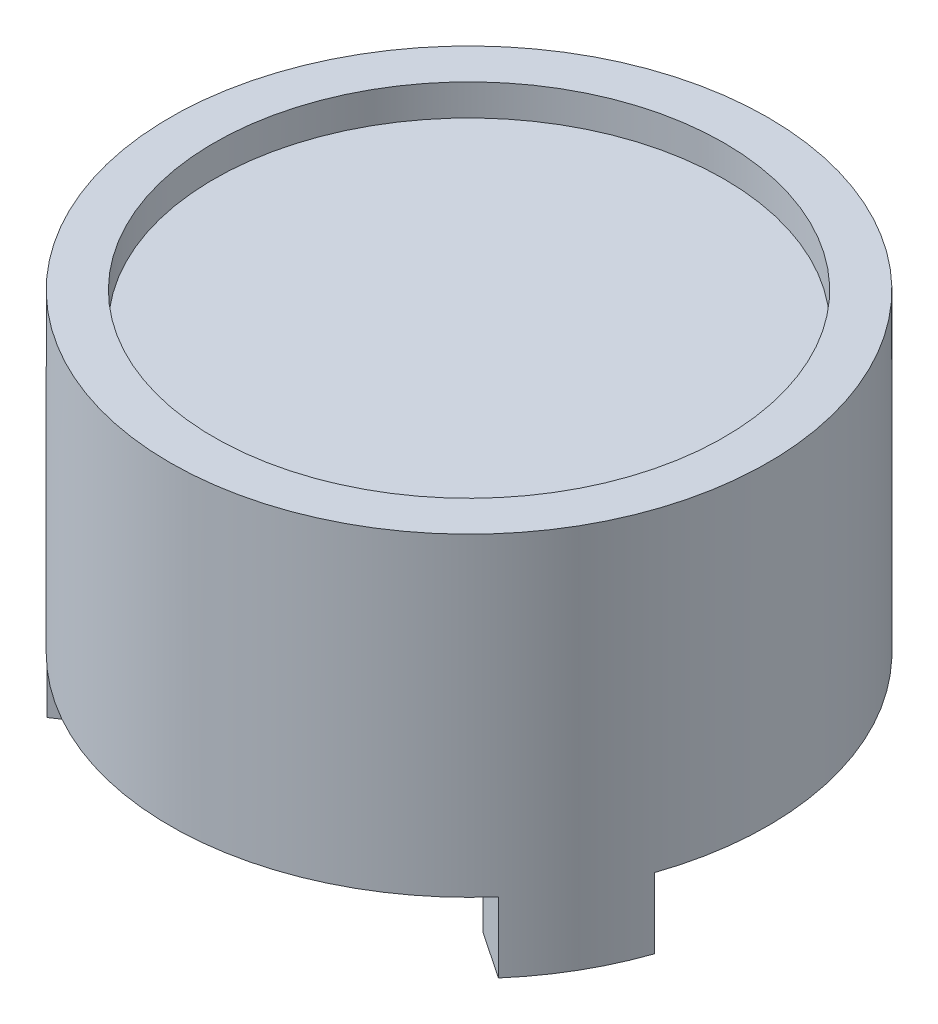
ISO-10303-21;
HEADER;
FILE_DESCRIPTION(('STEP AP214'),'2;1');
FILE_NAME('part.step','',(''),(''),'','','');
FILE_SCHEMA(('AUTOMOTIVE_DESIGN { 1 0 10303 214 1 1 1 1 }'));
ENDSEC;
DATA;
#1=APPLICATION_CONTEXT('core data for automotive mechanical design processes');
#2=APPLICATION_PROTOCOL_DEFINITION('international standard','automotive_design',2000,#1);
#3=PRODUCT_CONTEXT('',#1,'mechanical');
#4=PRODUCT('Part','Part','',(#3));
#5=PRODUCT_RELATED_PRODUCT_CATEGORY('part','',(#4));
#6=PRODUCT_DEFINITION_FORMATION('','',#4);
#7=PRODUCT_DEFINITION_CONTEXT('part definition',#1,'design');
#8=PRODUCT_DEFINITION('design','',#6,#7);
#9=PRODUCT_DEFINITION_SHAPE('','',#8);
#10=(LENGTH_UNIT() NAMED_UNIT(*) SI_UNIT(.MILLI.,.METRE.));
#11=(NAMED_UNIT(*) PLANE_ANGLE_UNIT() SI_UNIT($,.RADIAN.));
#12=(NAMED_UNIT(*) SI_UNIT($,.STERADIAN.) SOLID_ANGLE_UNIT());
#13=UNCERTAINTY_MEASURE_WITH_UNIT(LENGTH_MEASURE(1.E-05),#10,'distance_accuracy_value','');
#14=(GEOMETRIC_REPRESENTATION_CONTEXT(3) GLOBAL_UNCERTAINTY_ASSIGNED_CONTEXT((#13)) GLOBAL_UNIT_ASSIGNED_CONTEXT((#10,
#11,#12)) REPRESENTATION_CONTEXT('',''));
#15=CARTESIAN_POINT('',(0.,0.,0.));
#16=DIRECTION('',(0.,0.,1.));
#17=DIRECTION('',(1.,0.,0.));
#18=AXIS2_PLACEMENT_3D('',#15,#16,#17);
#19=CARTESIAN_POINT('',(13.5,0.,0.));
#20=DIRECTION('',(0.,-1.,0.));
#21=DIRECTION('',(0.,0.,-1.));
#22=AXIS2_PLACEMENT_3D('',#19,#20,#21);
#23=PLANE('',#22);
#24=CARTESIAN_POINT('',(0.,0.,0.));
#25=DIRECTION('',(0.,-1.,0.));
#26=DIRECTION('',(0.,0.,-1.));
#27=AXIS2_PLACEMENT_3D('',#24,#25,#26);
#28=CIRCLE('',#27,17.);
#29=CARTESIAN_POINT('',(-16.0758866509983,0.,5.52864073568305));
#30=VERTEX_POINT('',#29);
#31=CARTESIAN_POINT('',(-3.25,0.,-16.6864465959652));
#32=VERTEX_POINT('',#31);
#33=EDGE_CURVE('E307',#30,#32,#28,.T.);
#34=ORIENTED_EDGE('',*,*,#33,.T.);
#35=DIRECTION('',(0.0707642638276949,0.,0.997493067126245));
#36=VECTOR('',#35,1.);
#37=CARTESIAN_POINT('',(-3.25,0.,-16.6864465959652));
#38=LINE('',#37,#36);
#39=CARTESIAN_POINT('',(-3.02073627194071,0.,-13.4547450715984));
#40=VERTEX_POINT('',#39);
#41=EDGE_CURVE('E179',#32,#40,#38,.T.);
#42=ORIENTED_EDGE('',*,*,#41,.T.);
#43=CARTESIAN_POINT('',(-2.76737303289064,0.,-13.4727191946106));
#44=DIRECTION('',(0.,-1.,0.));
#45=DIRECTION('',(0.,0.,-1.));
#46=AXIS2_PLACEMENT_3D('',#43,#44,#45);
#47=CIRCLE('',#46,0.254);
#48=CARTESIAN_POINT('',(-2.71626697280963,0.,-13.2239137070847));
#49=VERTEX_POINT('',#48);
#50=EDGE_CURVE('E256',#40,#49,#47,.F.);
#51=ORIENTED_EDGE('',*,*,#50,.T.);
#52=CARTESIAN_POINT('',(0.,0.,0.));
#53=DIRECTION('',(0.,-1.,0.));
#54=DIRECTION('',(0.,0.,-1.));
#55=AXIS2_PLACEMENT_3D('',#52,#53,#54);
#56=CIRCLE('',#55,13.5);
#57=CARTESIAN_POINT('',(-12.8103786941935,0.,4.25960065162845));
#58=VERTEX_POINT('',#57);
#59=EDGE_CURVE('E309',#58,#49,#56,.T.);
#60=ORIENTED_EDGE('',*,*,#59,.F.);
#61=CARTESIAN_POINT('',(-13.0514035970324,0.,4.33974424907391));
#62=DIRECTION('',(0.,-1.,0.));
#63=DIRECTION('',(0.,0.,-1.));
#64=AXIS2_PLACEMENT_3D('',#61,#62,#63);
#65=CIRCLE('',#64,0.254);
#66=CARTESIAN_POINT('',(-13.1625191694181,0.,4.11133818616532));
#67=VERTEX_POINT('',#66);
#68=EDGE_CURVE('E251',#58,#67,#65,.F.);
#69=ORIENTED_EDGE('',*,*,#68,.T.);
#70=DIRECTION('',(-0.899236468144036,0.,0.437462883408226));
#71=VECTOR('',#70,1.);
#72=CARTESIAN_POINT('',(-16.0758866509983,0.,5.52864073568305));
#73=LINE('',#72,#71);
#74=EDGE_CURVE('E293',#67,#30,#73,.T.);
#75=ORIENTED_EDGE('',*,*,#74,.T.);
#76=EDGE_LOOP('',(#34,#42,#51,#60,#69,#75));
#77=FACE_BOUND('',#76,.T.);
#78=ADVANCED_FACE('F48',(#77),#23,.T.);
#79=CARTESIAN_POINT('',(-16.0758866509983,-4.,5.52864073568305));
#80=DIRECTION('',(-0.437462883408226,0.,-0.899236468144036));
#81=DIRECTION('',(-0.899236468144036,0.,0.437462883408226));
#82=AXIS2_PLACEMENT_3D('',#79,#80,#81);
#83=PLANE('',#82);
#84=ORIENTED_EDGE('',*,*,#74,.F.);
#85=DIRECTION('',(0.,-1.,0.));
#86=VECTOR('',#85,1.);
#87=CARTESIAN_POINT('',(-13.1625191694181,-4.,4.11133818616532));
#88=LINE('',#87,#86);
#89=CARTESIAN_POINT('',(-13.1625191694181,-4.,4.11133818616532));
#90=VERTEX_POINT('',#89);
#91=EDGE_CURVE('E292',#67,#90,#88,.T.);
#92=ORIENTED_EDGE('',*,*,#91,.T.);
#93=DIRECTION('',(-0.899236468144036,0.,0.437462883408226));
#94=VECTOR('',#93,1.);
#95=CARTESIAN_POINT('',(-16.0758866509983,-4.,5.52864073568305));
#96=LINE('',#95,#94);
#97=CARTESIAN_POINT('',(-16.0758866509983,-4.,5.52864073568305));
#98=VERTEX_POINT('',#97);
#99=EDGE_CURVE('E411',#90,#98,#96,.T.);
#100=ORIENTED_EDGE('',*,*,#99,.T.);
#101=DIRECTION('',(0.,1.,0.));
#102=VECTOR('',#101,1.);
#103=CARTESIAN_POINT('',(-16.0758866509983,-4.,5.52864073568305));
#104=LINE('',#103,#102);
#105=EDGE_CURVE('E282',#98,#30,#104,.T.);
#106=ORIENTED_EDGE('',*,*,#105,.T.);
#107=EDGE_LOOP('',(#84,#92,#100,#106));
#108=FACE_BOUND('',#107,.T.);
#109=ADVANCED_FACE('F367',(#108),#83,.T.);
#110=CARTESIAN_POINT('',(-12.8258866509984,-4.,11.1578058602819));
#111=DIRECTION('',(0.560030183718003,0.,0.828472204316343));
#112=DIRECTION('',(0.828472204316343,0.,-0.560030183718003));
#113=AXIS2_PLACEMENT_3D('',#110,#111,#112);
#114=PLANE('',#113);
#115=DIRECTION('',(0.828472204316343,0.,-0.560030183718003));
#116=VECTOR('',#115,1.);
#117=CARTESIAN_POINT('',(-12.8258866509984,-4.,11.1578058602819));
#118=LINE('',#117,#116);
#119=CARTESIAN_POINT('',(-12.8258866509984,-4.,11.1578058602819));
#120=VERTEX_POINT('',#119);
#121=CARTESIAN_POINT('',(-10.1417828974774,-4.,9.34340688543286));
#122=VERTEX_POINT('',#121);
#123=EDGE_CURVE('E400',#120,#122,#118,.T.);
#124=ORIENTED_EDGE('',*,*,#123,.T.);
#125=DIRECTION('',(0.,-1.,0.));
#126=VECTOR('',#125,1.);
#127=CARTESIAN_POINT('',(-10.1417828974774,-4.,9.34340688543286));
#128=LINE('',#127,#126);
#129=CARTESIAN_POINT('',(-10.1417828974774,0.,9.34340688543286));
#130=VERTEX_POINT('',#129);
#131=EDGE_CURVE('E399',#122,#130,#128,.F.);
#132=ORIENTED_EDGE('',*,*,#131,.T.);
#133=DIRECTION('',(0.828472204316343,0.,-0.560030183718003));
#134=VECTOR('',#133,1.);
#135=CARTESIAN_POINT('',(-12.8258866509984,0.,11.1578058602819));
#136=LINE('',#135,#134);
#137=CARTESIAN_POINT('',(-12.8258866509984,0.,11.1578058602819));
#138=VERTEX_POINT('',#137);
#139=EDGE_CURVE('E390',#138,#130,#136,.T.);
#140=ORIENTED_EDGE('',*,*,#139,.F.);
#141=DIRECTION('',(0.,1.,0.));
#142=VECTOR('',#141,1.);
#143=CARTESIAN_POINT('',(-12.8258866509984,-4.,11.1578058602819));
#144=LINE('',#143,#142);
#145=EDGE_CURVE('E296',#120,#138,#144,.T.);
#146=ORIENTED_EDGE('',*,*,#145,.F.);
#147=EDGE_LOOP('',(#124,#132,#140,#146));
#148=FACE_BOUND('',#147,.T.);
#149=ADVANCED_FACE('F372',(#148),#114,.T.);
#150=CARTESIAN_POINT('',(0.,-4.,0.));
#151=DIRECTION('',(0.,-1.,0.));
#152=DIRECTION('',(-0.866025403784443,0.,0.499999999999992));
#153=AXIS2_PLACEMENT_3D('',#150,#151,#152);
#154=PLANE('',#153);
#155=ORIENTED_EDGE('',*,*,#99,.F.);
#156=CARTESIAN_POINT('',(-13.0514035970324,-4.,4.33974424907391));
#157=DIRECTION('',(0.,-1.,0.));
#158=DIRECTION('',(0.,0.,-1.));
#159=AXIS2_PLACEMENT_3D('',#156,#157,#158);
#160=CIRCLE('',#159,0.254);
#161=CARTESIAN_POINT('',(-12.8103786941935,-4.,4.25960065162845));
#162=VERTEX_POINT('',#161);
#163=EDGE_CURVE('E444',#90,#162,#160,.T.);
#164=ORIENTED_EDGE('',*,*,#163,.T.);
#165=CARTESIAN_POINT('',(0.,-4.,0.));
#166=DIRECTION('',(0.,-1.,0.));
#167=DIRECTION('',(0.866025403784443,0.,-0.499999999999992));
#168=AXIS2_PLACEMENT_3D('',#165,#166,#167);
#169=CIRCLE('',#168,13.5);
#170=CARTESIAN_POINT('',(-10.0941117213839,-4.,8.96431305545607));
#171=VERTEX_POINT('',#170);
#172=EDGE_CURVE('E409',#171,#162,#169,.T.);
#173=ORIENTED_EDGE('',*,*,#172,.F.);
#174=CARTESIAN_POINT('',(-10.2840305641418,-4.,9.13297494553651));
#175=DIRECTION('',(0.,-1.,0.));
#176=DIRECTION('',(0.,0.,-1.));
#177=AXIS2_PLACEMENT_3D('',#174,#175,#176);
#178=CIRCLE('',#177,0.254);
#179=EDGE_CURVE('E443',#171,#122,#178,.T.);
#180=ORIENTED_EDGE('',*,*,#179,.T.);
#181=ORIENTED_EDGE('',*,*,#123,.F.);
#182=CARTESIAN_POINT('',(0.,-4.,0.));
#183=DIRECTION('',(0.,1.,0.));
#184=DIRECTION('',(-0.866025403784443,0.,0.499999999999992));
#185=AXIS2_PLACEMENT_3D('',#182,#183,#184);
#186=CIRCLE('',#185,17.);
#187=EDGE_CURVE('E324',#98,#120,#186,.T.);
#188=ORIENTED_EDGE('',*,*,#187,.F.);
#189=EDGE_LOOP('',(#155,#164,#173,#180,#181,#188));
#190=FACE_BOUND('',#189,.T.);
#191=ADVANCED_FACE('F379',(#190),#154,.T.);
#192=CARTESIAN_POINT('',(12.8258866509982,0.,11.1578058602821));
#193=VERTEX_POINT('',#192);
#194=EDGE_CURVE('E319',#193,#138,#28,.T.);
#195=ORIENTED_EDGE('',*,*,#194,.T.);
#196=ORIENTED_EDGE('',*,*,#139,.T.);
#197=CARTESIAN_POINT('',(-10.2840305641418,0.,9.13297494553651));
#198=DIRECTION('',(0.,-1.,0.));
#199=DIRECTION('',(0.,0.,-1.));
#200=AXIS2_PLACEMENT_3D('',#197,#198,#199);
#201=CIRCLE('',#200,0.254);
#202=CARTESIAN_POINT('',(-10.0941117213839,0.,8.96431305545607));
#203=VERTEX_POINT('',#202);
#204=EDGE_CURVE('E253',#130,#203,#201,.F.);
#205=ORIENTED_EDGE('',*,*,#204,.T.);
#206=CARTESIAN_POINT('',(10.0941117213838,0.,8.96431305545621));
#207=VERTEX_POINT('',#206);
#208=EDGE_CURVE('E222',#207,#203,#56,.T.);
#209=ORIENTED_EDGE('',*,*,#208,.F.);
#210=CARTESIAN_POINT('',(10.2840305641417,0.,9.13297494553665));
#211=DIRECTION('',(0.,-1.,0.));
#212=DIRECTION('',(0.,0.,-1.));
#213=AXIS2_PLACEMENT_3D('',#210,#211,#212);
#214=CIRCLE('',#213,0.254);
#215=CARTESIAN_POINT('',(10.1417828974773,0.,9.343406885433));
#216=VERTEX_POINT('',#215);
#217=EDGE_CURVE('E13',#207,#216,#214,.F.);
#218=ORIENTED_EDGE('',*,*,#217,.T.);
#219=DIRECTION('',(0.828472204316335,0.,0.560030183718015));
#220=VECTOR('',#219,1.);
#221=CARTESIAN_POINT('',(12.8258866509982,0.,11.1578058602821));
#222=LINE('',#221,#220);
#223=EDGE_CURVE('E238',#216,#193,#222,.T.);
#224=ORIENTED_EDGE('',*,*,#223,.T.);
#225=EDGE_LOOP('',(#195,#196,#205,#209,#218,#224));
#226=FACE_BOUND('',#225,.T.);
#227=ADVANCED_FACE('F364',(#226),#23,.T.);
#228=CARTESIAN_POINT('',(12.8258866509982,-4.,11.1578058602821));
#229=DIRECTION('',(-0.560030183718015,0.,0.828472204316335));
#230=DIRECTION('',(0.828472204316335,0.,0.560030183718015));
#231=AXIS2_PLACEMENT_3D('',#228,#229,#230);
#232=PLANE('',#231);
#233=ORIENTED_EDGE('',*,*,#223,.F.);
#234=DIRECTION('',(0.,-1.,0.));
#235=VECTOR('',#234,1.);
#236=CARTESIAN_POINT('',(10.1417828974773,-4.,9.343406885433));
#237=LINE('',#236,#235);
#238=CARTESIAN_POINT('',(10.1417828974773,-4.,9.343406885433));
#239=VERTEX_POINT('',#238);
#240=EDGE_CURVE('E68',#216,#239,#237,.T.);
#241=ORIENTED_EDGE('',*,*,#240,.T.);
#242=DIRECTION('',(0.828472204316335,0.,0.560030183718015));
#243=VECTOR('',#242,1.);
#244=CARTESIAN_POINT('',(12.8258866509982,-4.,11.1578058602821));
#245=LINE('',#244,#243);
#246=CARTESIAN_POINT('',(12.8258866509982,-4.,11.1578058602821));
#247=VERTEX_POINT('',#246);
#248=EDGE_CURVE('E221',#239,#247,#245,.T.);
#249=ORIENTED_EDGE('',*,*,#248,.T.);
#250=DIRECTION('',(0.,1.,0.));
#251=VECTOR('',#250,1.);
#252=CARTESIAN_POINT('',(12.8258866509982,-4.,11.1578058602821));
#253=LINE('',#252,#251);
#254=EDGE_CURVE('E243',#247,#193,#253,.T.);
#255=ORIENTED_EDGE('',*,*,#254,.T.);
#256=EDGE_LOOP('',(#233,#241,#249,#255));
#257=FACE_BOUND('',#256,.T.);
#258=ADVANCED_FACE('F378',(#257),#232,.T.);
#259=CARTESIAN_POINT('',(16.0758866509982,-4.,5.52864073568327));
#260=DIRECTION('',(0.437462883408239,0.,-0.89923646814403));
#261=DIRECTION('',(-0.899236468144031,0.,-0.437462883408239));
#262=AXIS2_PLACEMENT_3D('',#259,#260,#261);
#263=PLANE('',#262);
#264=DIRECTION('',(-0.89923646814403,0.,-0.437462883408239));
#265=VECTOR('',#264,1.);
#266=CARTESIAN_POINT('',(16.0758866509982,-4.,5.52864073568327));
#267=LINE('',#266,#265);
#268=CARTESIAN_POINT('',(16.0758866509982,-4.,5.52864073568327));
#269=VERTEX_POINT('',#268);
#270=CARTESIAN_POINT('',(13.162519169418,-4.,4.11133818616551));
#271=VERTEX_POINT('',#270);
#272=EDGE_CURVE('E227',#269,#271,#267,.T.);
#273=ORIENTED_EDGE('',*,*,#272,.T.);
#274=DIRECTION('',(0.,-1.,0.));
#275=VECTOR('',#274,1.);
#276=CARTESIAN_POINT('',(13.162519169418,-4.,4.11133818616551));
#277=LINE('',#276,#275);
#278=CARTESIAN_POINT('',(13.162519169418,0.,4.11133818616551));
#279=VERTEX_POINT('',#278);
#280=EDGE_CURVE('E424',#271,#279,#277,.F.);
#281=ORIENTED_EDGE('',*,*,#280,.T.);
#282=DIRECTION('',(-0.89923646814403,0.,-0.437462883408239));
#283=VECTOR('',#282,1.);
#284=CARTESIAN_POINT('',(16.0758866509982,0.,5.52864073568327));
#285=LINE('',#284,#283);
#286=CARTESIAN_POINT('',(16.0758866509982,0.,5.52864073568327));
#287=VERTEX_POINT('',#286);
#288=EDGE_CURVE('E230',#287,#279,#285,.T.);
#289=ORIENTED_EDGE('',*,*,#288,.F.);
#290=DIRECTION('',(0.,1.,0.));
#291=VECTOR('',#290,1.);
#292=CARTESIAN_POINT('',(16.0758866509982,-4.,5.52864073568327));
#293=LINE('',#292,#291);
#294=EDGE_CURVE('E233',#269,#287,#293,.T.);
#295=ORIENTED_EDGE('',*,*,#294,.F.);
#296=EDGE_LOOP('',(#273,#281,#289,#295));
#297=FACE_BOUND('',#296,.T.);
#298=ADVANCED_FACE('F384',(#297),#263,.T.);
#299=CARTESIAN_POINT('',(0.,-4.,0.));
#300=DIRECTION('',(0.,-1.,0.));
#301=DIRECTION('',(0.866025403784436,0.,0.500000000000004));
#302=AXIS2_PLACEMENT_3D('',#299,#300,#301);
#303=PLANE('',#302);
#304=CARTESIAN_POINT('',(0.,-4.,0.));
#305=DIRECTION('',(0.,-1.,0.));
#306=DIRECTION('',(-0.866025403784436,0.,-0.500000000000004));
#307=AXIS2_PLACEMENT_3D('',#304,#305,#306);
#308=CIRCLE('',#307,13.5);
#309=CARTESIAN_POINT('',(12.8103786941934,-4.,4.25960065162863));
#310=VERTEX_POINT('',#309);
#311=CARTESIAN_POINT('',(10.0941117213838,-4.,8.96431305545621));
#312=VERTEX_POINT('',#311);
#313=EDGE_CURVE('E224',#310,#312,#308,.T.);
#314=ORIENTED_EDGE('',*,*,#313,.F.);
#315=CARTESIAN_POINT('',(13.0514035970323,-4.,4.33974424907409));
#316=DIRECTION('',(0.,-1.,0.));
#317=DIRECTION('',(0.,0.,-1.));
#318=AXIS2_PLACEMENT_3D('',#315,#316,#317);
#319=CIRCLE('',#318,0.254);
#320=EDGE_CURVE('E248',#310,#271,#319,.T.);
#321=ORIENTED_EDGE('',*,*,#320,.T.);
#322=ORIENTED_EDGE('',*,*,#272,.F.);
#323=CARTESIAN_POINT('',(0.,-4.,0.));
#324=DIRECTION('',(0.,1.,0.));
#325=DIRECTION('',(0.866025403784436,0.,0.500000000000004));
#326=AXIS2_PLACEMENT_3D('',#323,#324,#325);
#327=CIRCLE('',#326,17.);
#328=EDGE_CURVE('E219',#247,#269,#327,.T.);
#329=ORIENTED_EDGE('',*,*,#328,.F.);
#330=ORIENTED_EDGE('',*,*,#248,.F.);
#331=CARTESIAN_POINT('',(10.2840305641417,-4.,9.13297494553665));
#332=DIRECTION('',(0.,-1.,0.));
#333=DIRECTION('',(0.,0.,-1.));
#334=AXIS2_PLACEMENT_3D('',#331,#332,#333);
#335=CIRCLE('',#334,0.254);
#336=EDGE_CURVE('E429',#239,#312,#335,.T.);
#337=ORIENTED_EDGE('',*,*,#336,.T.);
#338=EDGE_LOOP('',(#314,#321,#322,#329,#330,#337));
#339=FACE_BOUND('',#338,.T.);
#340=ADVANCED_FACE('F362',(#339),#303,.T.);
#341=CARTESIAN_POINT('',(3.25,0.,-16.6864465959652));
#342=VERTEX_POINT('',#341);
#343=EDGE_CURVE('E314',#342,#287,#28,.T.);
#344=ORIENTED_EDGE('',*,*,#343,.T.);
#345=ORIENTED_EDGE('',*,*,#288,.T.);
#346=CARTESIAN_POINT('',(13.0514035970323,0.,4.33974424907409));
#347=DIRECTION('',(0.,-1.,0.));
#348=DIRECTION('',(0.,0.,-1.));
#349=AXIS2_PLACEMENT_3D('',#346,#347,#348);
#350=CIRCLE('',#349,0.254);
#351=CARTESIAN_POINT('',(12.8103786941934,0.,4.25960065162863));
#352=VERTEX_POINT('',#351);
#353=EDGE_CURVE('E56',#279,#352,#350,.F.);
#354=ORIENTED_EDGE('',*,*,#353,.T.);
#355=CARTESIAN_POINT('',(2.71626697280963,0.,-13.2239137070847));
#356=VERTEX_POINT('',#355);
#357=EDGE_CURVE('E264',#356,#352,#56,.T.);
#358=ORIENTED_EDGE('',*,*,#357,.F.);
#359=CARTESIAN_POINT('',(2.76737303289064,0.,-13.4727191946106));
#360=DIRECTION('',(0.,-1.,0.));
#361=DIRECTION('',(0.,0.,-1.));
#362=AXIS2_PLACEMENT_3D('',#359,#360,#361);
#363=CIRCLE('',#362,0.254);
#364=CARTESIAN_POINT('',(3.02073627194071,0.,-13.4547450715984));
#365=VERTEX_POINT('',#364);
#366=EDGE_CURVE('E259',#356,#365,#363,.F.);
#367=ORIENTED_EDGE('',*,*,#366,.T.);
#368=DIRECTION('',(0.0707642638276949,0.,-0.997493067126245));
#369=VECTOR('',#368,1.);
#370=CARTESIAN_POINT('',(3.25,0.,-16.6864465959652));
#371=LINE('',#370,#369);
#372=EDGE_CURVE('E201',#365,#342,#371,.T.);
#373=ORIENTED_EDGE('',*,*,#372,.T.);
#374=EDGE_LOOP('',(#344,#345,#354,#358,#367,#373));
#375=FACE_BOUND('',#374,.T.);
#376=ADVANCED_FACE('F263',(#375),#23,.T.);
#377=CARTESIAN_POINT('',(0.,16.1036,0.));
#378=DIRECTION('',(0.,1.,0.));
#379=DIRECTION('',(0.,0.,1.));
#380=AXIS2_PLACEMENT_3D('',#377,#378,#379);
#381=PLANE('',#380);
#382=CARTESIAN_POINT('',(0.,16.1036,0.));
#383=DIRECTION('',(0.,-1.,0.));
#384=DIRECTION('',(0.,0.,-1.));
#385=AXIS2_PLACEMENT_3D('',#382,#383,#384);
#386=CIRCLE('',#385,14.5);
#387=CARTESIAN_POINT('',(0.,16.1036,-14.5));
#388=VERTEX_POINT('',#387);
#389=EDGE_CURVE('E321',#388,#388,#386,.T.);
#390=ORIENTED_EDGE('',*,*,#389,.F.);
#391=EDGE_LOOP('',(#390));
#392=FACE_BOUND('',#391,.T.);
#393=ADVANCED_FACE('F353',(#392),#381,.T.);
#394=CARTESIAN_POINT('',(0.,0.,0.));
#395=DIRECTION('',(0.,-1.,0.));
#396=DIRECTION('',(0.,0.,-1.));
#397=AXIS2_PLACEMENT_3D('',#394,#395,#396);
#398=CYLINDRICAL_SURFACE('',#397,14.5);
#399=ORIENTED_EDGE('',*,*,#389,.T.);
#400=EDGE_LOOP('',(#399));
#401=FACE_BOUND('',#400,.T.);
#402=CARTESIAN_POINT('',(0.,17.8816,0.));
#403=DIRECTION('',(0.,-1.,0.));
#404=DIRECTION('',(0.,0.,-1.));
#405=AXIS2_PLACEMENT_3D('',#402,#403,#404);
#406=CIRCLE('',#405,14.5);
#407=CARTESIAN_POINT('',(0.,17.8816,-14.5));
#408=VERTEX_POINT('',#407);
#409=EDGE_CURVE('E345',#408,#408,#406,.T.);
#410=ORIENTED_EDGE('',*,*,#409,.F.);
#411=EDGE_LOOP('',(#410));
#412=FACE_BOUND('',#411,.T.);
#413=ADVANCED_FACE('F350',(#401,#412),#398,.F.);
#414=CARTESIAN_POINT('',(17.,17.8816,0.));
#415=DIRECTION('',(0.,1.,0.));
#416=DIRECTION('',(0.,0.,1.));
#417=AXIS2_PLACEMENT_3D('',#414,#415,#416);
#418=PLANE('',#417);
#419=ORIENTED_EDGE('',*,*,#409,.T.);
#420=EDGE_LOOP('',(#419));
#421=FACE_BOUND('',#420,.T.);
#422=CARTESIAN_POINT('',(0.,17.8816,0.));
#423=DIRECTION('',(0.,-1.,0.));
#424=DIRECTION('',(0.,0.,-1.));
#425=AXIS2_PLACEMENT_3D('',#422,#423,#424);
#426=CIRCLE('',#425,17.);
#427=CARTESIAN_POINT('',(0.,17.8816,-17.));
#428=VERTEX_POINT('',#427);
#429=EDGE_CURVE('E342',#428,#428,#426,.T.);
#430=ORIENTED_EDGE('',*,*,#429,.F.);
#431=EDGE_LOOP('',(#430));
#432=FACE_BOUND('',#431,.T.);
#433=ADVANCED_FACE('F360',(#421,#432),#418,.T.);
#434=CARTESIAN_POINT('',(0.,0.,0.));
#435=DIRECTION('',(0.,-1.,0.));
#436=DIRECTION('',(0.,0.,-1.));
#437=AXIS2_PLACEMENT_3D('',#434,#435,#436);
#438=CYLINDRICAL_SURFACE('',#437,17.);
#439=ORIENTED_EDGE('',*,*,#429,.T.);
#440=EDGE_LOOP('',(#439));
#441=FACE_BOUND('',#440,.T.);
#442=ORIENTED_EDGE('',*,*,#194,.F.);
#443=ORIENTED_EDGE('',*,*,#254,.F.);
#444=ORIENTED_EDGE('',*,*,#328,.T.);
#445=ORIENTED_EDGE('',*,*,#294,.T.);
#446=ORIENTED_EDGE('',*,*,#343,.F.);
#447=DIRECTION('',(0.,1.,0.));
#448=VECTOR('',#447,1.);
#449=CARTESIAN_POINT('',(3.25,-4.,-16.6864465959652));
#450=LINE('',#449,#448);
#451=CARTESIAN_POINT('',(3.25,-4.,-16.6864465959652));
#452=VERTEX_POINT('',#451);
#453=EDGE_CURVE('E183',#452,#342,#450,.T.);
#454=ORIENTED_EDGE('',*,*,#453,.F.);
#455=CARTESIAN_POINT('',(0.,-4.,0.));
#456=DIRECTION('',(0.,1.,0.));
#457=DIRECTION('',(0.,0.,-1.));
#458=AXIS2_PLACEMENT_3D('',#455,#456,#457);
#459=CIRCLE('',#458,17.);
#460=CARTESIAN_POINT('',(-3.25,-4.,-16.6864465959652));
#461=VERTEX_POINT('',#460);
#462=EDGE_CURVE('E191',#452,#461,#459,.T.);
#463=ORIENTED_EDGE('',*,*,#462,.T.);
#464=DIRECTION('',(0.,1.,0.));
#465=VECTOR('',#464,1.);
#466=CARTESIAN_POINT('',(-3.25,-4.,-16.6864465959652));
#467=LINE('',#466,#465);
#468=EDGE_CURVE('E172',#461,#32,#467,.T.);
#469=ORIENTED_EDGE('',*,*,#468,.T.);
#470=ORIENTED_EDGE('',*,*,#33,.F.);
#471=ORIENTED_EDGE('',*,*,#105,.F.);
#472=ORIENTED_EDGE('',*,*,#187,.T.);
#473=ORIENTED_EDGE('',*,*,#145,.T.);
#474=EDGE_LOOP('',(#442,#443,#444,#445,#446,#454,#463,#469,#470,#471,#472,#473));
#475=FACE_BOUND('',#474,.T.);
#476=ADVANCED_FACE('F198',(#441,#475),#438,.T.);
#477=CARTESIAN_POINT('',(0.,0.,0.));
#478=DIRECTION('',(0.,-1.,0.));
#479=DIRECTION('',(0.,0.,-1.));
#480=AXIS2_PLACEMENT_3D('',#477,#478,#479);
#481=CYLINDRICAL_SURFACE('',#480,13.5);
#482=ORIENTED_EDGE('',*,*,#172,.T.);
#483=DIRECTION('',(0.,-1.,0.));
#484=VECTOR('',#483,1.);
#485=CARTESIAN_POINT('',(-12.8103786941935,0.,4.25960065162845));
#486=LINE('',#485,#484);
#487=EDGE_CURVE('E289',#162,#58,#486,.F.);
#488=ORIENTED_EDGE('',*,*,#487,.T.);
#489=ORIENTED_EDGE('',*,*,#59,.T.);
#490=DIRECTION('',(0.,-1.,0.));
#491=VECTOR('',#490,1.);
#492=CARTESIAN_POINT('',(-2.71626697280963,0.,-13.2239137070847));
#493=LINE('',#492,#491);
#494=CARTESIAN_POINT('',(-2.71626697280963,-4.,-13.2239137070847));
#495=VERTEX_POINT('',#494);
#496=EDGE_CURVE('E279',#49,#495,#493,.T.);
#497=ORIENTED_EDGE('',*,*,#496,.T.);
#498=CARTESIAN_POINT('',(0.,-4.,0.));
#499=DIRECTION('',(0.,-1.,0.));
#500=DIRECTION('',(0.,0.,1.));
#501=AXIS2_PLACEMENT_3D('',#498,#499,#500);
#502=CIRCLE('',#501,13.5);
#503=CARTESIAN_POINT('',(2.71626697280963,-4.,-13.2239137070847));
#504=VERTEX_POINT('',#503);
#505=EDGE_CURVE('E194',#495,#504,#502,.T.);
#506=ORIENTED_EDGE('',*,*,#505,.T.);
#507=DIRECTION('',(0.,-1.,0.));
#508=VECTOR('',#507,1.);
#509=CARTESIAN_POINT('',(2.71626697280963,0.,-13.2239137070847));
#510=LINE('',#509,#508);
#511=EDGE_CURVE('E275',#504,#356,#510,.F.);
#512=ORIENTED_EDGE('',*,*,#511,.T.);
#513=ORIENTED_EDGE('',*,*,#357,.T.);
#514=DIRECTION('',(0.,-1.,0.));
#515=VECTOR('',#514,1.);
#516=CARTESIAN_POINT('',(12.8103786941934,0.,4.25960065162863));
#517=LINE('',#516,#515);
#518=EDGE_CURVE('E271',#352,#310,#517,.T.);
#519=ORIENTED_EDGE('',*,*,#518,.T.);
#520=ORIENTED_EDGE('',*,*,#313,.T.);
#521=DIRECTION('',(0.,-1.,0.));
#522=VECTOR('',#521,1.);
#523=CARTESIAN_POINT('',(10.0941117213838,0.,8.96431305545621));
#524=LINE('',#523,#522);
#525=EDGE_CURVE('E276',#312,#207,#524,.F.);
#526=ORIENTED_EDGE('',*,*,#525,.T.);
#527=ORIENTED_EDGE('',*,*,#208,.T.);
#528=DIRECTION('',(0.,-1.,0.));
#529=VECTOR('',#528,1.);
#530=CARTESIAN_POINT('',(-10.0941117213839,0.,8.96431305545607));
#531=LINE('',#530,#529);
#532=EDGE_CURVE('E287',#203,#171,#531,.T.);
#533=ORIENTED_EDGE('',*,*,#532,.T.);
#534=EDGE_LOOP('',(#482,#488,#489,#497,#506,#512,#513,#519,#520,#526,#527,#533));
#535=FACE_BOUND('',#534,.T.);
#536=CARTESIAN_POINT('',(0.,1.,0.));
#537=DIRECTION('',(0.,-1.,0.));
#538=DIRECTION('',(0.,0.,-1.));
#539=AXIS2_PLACEMENT_3D('',#536,#537,#538);
#540=CIRCLE('',#539,13.5);
#541=CARTESIAN_POINT('',(0.,1.,-13.5));
#542=VERTEX_POINT('',#541);
#543=EDGE_CURVE('E337',#542,#542,#540,.T.);
#544=ORIENTED_EDGE('',*,*,#543,.F.);
#545=EDGE_LOOP('',(#544));
#546=FACE_BOUND('',#545,.T.);
#547=ADVANCED_FACE('F413',(#535,#546),#481,.F.);
#548=CARTESIAN_POINT('',(14.5,1.,0.));
#549=DIRECTION('',(0.,1.,0.));
#550=DIRECTION('',(0.,0.,1.));
#551=AXIS2_PLACEMENT_3D('',#548,#549,#550);
#552=PLANE('',#551);
#553=ORIENTED_EDGE('',*,*,#543,.T.);
#554=EDGE_LOOP('',(#553));
#555=FACE_BOUND('',#554,.T.);
#556=CARTESIAN_POINT('',(0.,1.,0.));
#557=DIRECTION('',(0.,-1.,0.));
#558=DIRECTION('',(0.,0.,-1.));
#559=AXIS2_PLACEMENT_3D('',#556,#557,#558);
#560=CIRCLE('',#559,14.5);
#561=CARTESIAN_POINT('',(0.,1.,-14.5));
#562=VERTEX_POINT('',#561);
#563=EDGE_CURVE('E333',#562,#562,#560,.T.);
#564=ORIENTED_EDGE('',*,*,#563,.F.);
#565=EDGE_LOOP('',(#564));
#566=FACE_BOUND('',#565,.T.);
#567=ADVANCED_FACE('F535',(#555,#566),#552,.T.);
#568=CARTESIAN_POINT('',(0.,0.,0.));
#569=DIRECTION('',(0.,-1.,0.));
#570=DIRECTION('',(0.,0.,-1.));
#571=AXIS2_PLACEMENT_3D('',#568,#569,#570);
#572=CYLINDRICAL_SURFACE('',#571,14.5);
#573=ORIENTED_EDGE('',*,*,#563,.T.);
#574=EDGE_LOOP('',(#573));
#575=FACE_BOUND('',#574,.T.);
#576=CARTESIAN_POINT('',(0.,3.4036,0.));
#577=DIRECTION('',(0.,-1.,0.));
#578=DIRECTION('',(0.,0.,-1.));
#579=AXIS2_PLACEMENT_3D('',#576,#577,#578);
#580=CIRCLE('',#579,14.5);
#581=CARTESIAN_POINT('',(0.,3.4036,-14.5));
#582=VERTEX_POINT('',#581);
#583=EDGE_CURVE('E329',#582,#582,#580,.T.);
#584=ORIENTED_EDGE('',*,*,#583,.F.);
#585=EDGE_LOOP('',(#584));
#586=FACE_BOUND('',#585,.T.);
#587=ADVANCED_FACE('F606',(#575,#586),#572,.F.);
#588=CARTESIAN_POINT('',(14.5,3.4036,0.));
#589=DIRECTION('',(0.,-1.,0.));
#590=DIRECTION('',(0.,0.,-1.));
#591=AXIS2_PLACEMENT_3D('',#588,#589,#590);
#592=PLANE('',#591);
#593=ORIENTED_EDGE('',*,*,#583,.T.);
#594=EDGE_LOOP('',(#593));
#595=FACE_BOUND('',#594,.T.);
#596=ADVANCED_FACE('F525',(#595),#592,.T.);
#597=CARTESIAN_POINT('',(3.25,-4.,-16.6864465959652));
#598=DIRECTION('',(0.997493067126245,0.,0.0707642638276949));
#599=DIRECTION('',(0.0707642638276949,0.,-0.997493067126246));
#600=AXIS2_PLACEMENT_3D('',#597,#598,#599);
#601=PLANE('',#600);
#602=ORIENTED_EDGE('',*,*,#372,.F.);
#603=DIRECTION('',(0.,-1.,0.));
#604=VECTOR('',#603,1.);
#605=CARTESIAN_POINT('',(3.02073627194071,-4.,-13.4547450715984));
#606=LINE('',#605,#604);
#607=CARTESIAN_POINT('',(3.02073627194071,-4.,-13.4547450715984));
#608=VERTEX_POINT('',#607);
#609=EDGE_CURVE('E421',#365,#608,#606,.T.);
#610=ORIENTED_EDGE('',*,*,#609,.T.);
#611=DIRECTION('',(0.0707642638276949,0.,-0.997493067126245));
#612=VECTOR('',#611,1.);
#613=CARTESIAN_POINT('',(3.25,-4.,-16.6864465959652));
#614=LINE('',#613,#612);
#615=EDGE_CURVE('E184',#608,#452,#614,.T.);
#616=ORIENTED_EDGE('',*,*,#615,.T.);
#617=ORIENTED_EDGE('',*,*,#453,.T.);
#618=EDGE_LOOP('',(#602,#610,#616,#617));
#619=FACE_BOUND('',#618,.T.);
#620=ADVANCED_FACE('F516',(#619),#601,.T.);
#621=CARTESIAN_POINT('',(-3.25,-4.,-16.6864465959652));
#622=DIRECTION('',(-0.997493067126245,0.,0.0707642638276949));
#623=DIRECTION('',(0.0707642638276949,0.,0.997493067126246));
#624=AXIS2_PLACEMENT_3D('',#621,#622,#623);
#625=PLANE('',#624);
#626=DIRECTION('',(0.0707642638276949,0.,0.997493067126245));
#627=VECTOR('',#626,1.);
#628=CARTESIAN_POINT('',(-3.25,-4.,-16.6864465959652));
#629=LINE('',#628,#627);
#630=CARTESIAN_POINT('',(-3.02073627194071,-4.,-13.4547450715984));
#631=VERTEX_POINT('',#630);
#632=EDGE_CURVE('E176',#461,#631,#629,.T.);
#633=ORIENTED_EDGE('',*,*,#632,.T.);
#634=DIRECTION('',(0.,-1.,0.));
#635=VECTOR('',#634,1.);
#636=CARTESIAN_POINT('',(-3.02073627194071,-4.,-13.4547450715984));
#637=LINE('',#636,#635);
#638=EDGE_CURVE('E420',#631,#40,#637,.F.);
#639=ORIENTED_EDGE('',*,*,#638,.T.);
#640=ORIENTED_EDGE('',*,*,#41,.F.);
#641=ORIENTED_EDGE('',*,*,#468,.F.);
#642=EDGE_LOOP('',(#633,#639,#640,#641));
#643=FACE_BOUND('',#642,.T.);
#644=ADVANCED_FACE('F174',(#643),#625,.T.);
#645=CARTESIAN_POINT('',(0.,-4.,0.));
#646=DIRECTION('',(0.,-1.,0.));
#647=DIRECTION('',(0.,0.,-1.));
#648=AXIS2_PLACEMENT_3D('',#645,#646,#647);
#649=PLANE('',#648);
#650=ORIENTED_EDGE('',*,*,#505,.F.);
#651=CARTESIAN_POINT('',(-2.76737303289064,-4.,-13.4727191946106));
#652=DIRECTION('',(0.,-1.,0.));
#653=DIRECTION('',(0.,0.,-1.));
#654=AXIS2_PLACEMENT_3D('',#651,#652,#653);
#655=CIRCLE('',#654,0.254);
#656=EDGE_CURVE('E193',#495,#631,#655,.T.);
#657=ORIENTED_EDGE('',*,*,#656,.T.);
#658=ORIENTED_EDGE('',*,*,#632,.F.);
#659=ORIENTED_EDGE('',*,*,#462,.F.);
#660=ORIENTED_EDGE('',*,*,#615,.F.);
#661=CARTESIAN_POINT('',(2.76737303289064,-4.,-13.4727191946106));
#662=DIRECTION('',(0.,-1.,0.));
#663=DIRECTION('',(0.,0.,-1.));
#664=AXIS2_PLACEMENT_3D('',#661,#662,#663);
#665=CIRCLE('',#664,0.254);
#666=EDGE_CURVE('E422',#608,#504,#665,.T.);
#667=ORIENTED_EDGE('',*,*,#666,.T.);
#668=EDGE_LOOP('',(#650,#657,#658,#659,#660,#667));
#669=FACE_BOUND('',#668,.T.);
#670=ADVANCED_FACE('F189',(#669),#649,.T.);
#671=CARTESIAN_POINT('',(-13.0514035970324,0.,4.33974424907391));
#672=DIRECTION('',(0.,-1.,0.));
#673=DIRECTION('',(0.,0.,-1.));
#674=AXIS2_PLACEMENT_3D('',#671,#672,#673);
#675=CYLINDRICAL_SURFACE('',#674,0.254);
#676=ORIENTED_EDGE('',*,*,#163,.F.);
#677=ORIENTED_EDGE('',*,*,#91,.F.);
#678=ORIENTED_EDGE('',*,*,#68,.F.);
#679=ORIENTED_EDGE('',*,*,#487,.F.);
#680=EDGE_LOOP('',(#676,#677,#678,#679));
#681=FACE_BOUND('',#680,.T.);
#682=ADVANCED_FACE('F451',(#681),#675,.T.);
#683=CARTESIAN_POINT('',(-10.2840305641418,0.,9.13297494553651));
#684=DIRECTION('',(0.,-1.,0.));
#685=DIRECTION('',(0.,0.,-1.));
#686=AXIS2_PLACEMENT_3D('',#683,#684,#685);
#687=CYLINDRICAL_SURFACE('',#686,0.254);
#688=ORIENTED_EDGE('',*,*,#179,.F.);
#689=ORIENTED_EDGE('',*,*,#532,.F.);
#690=ORIENTED_EDGE('',*,*,#204,.F.);
#691=ORIENTED_EDGE('',*,*,#131,.F.);
#692=EDGE_LOOP('',(#688,#689,#690,#691));
#693=FACE_BOUND('',#692,.T.);
#694=ADVANCED_FACE('F442',(#693),#687,.T.);
#695=CARTESIAN_POINT('',(-2.76737303289064,0.,-13.4727191946106));
#696=DIRECTION('',(0.,-1.,0.));
#697=DIRECTION('',(0.,0.,-1.));
#698=AXIS2_PLACEMENT_3D('',#695,#696,#697);
#699=CYLINDRICAL_SURFACE('',#698,0.254);
#700=ORIENTED_EDGE('',*,*,#656,.F.);
#701=ORIENTED_EDGE('',*,*,#496,.F.);
#702=ORIENTED_EDGE('',*,*,#50,.F.);
#703=ORIENTED_EDGE('',*,*,#638,.F.);
#704=EDGE_LOOP('',(#700,#701,#702,#703));
#705=FACE_BOUND('',#704,.T.);
#706=ADVANCED_FACE('F419',(#705),#699,.T.);
#707=CARTESIAN_POINT('',(2.76737303289064,0.,-13.4727191946106));
#708=DIRECTION('',(0.,-1.,0.));
#709=DIRECTION('',(0.,0.,-1.));
#710=AXIS2_PLACEMENT_3D('',#707,#708,#709);
#711=CYLINDRICAL_SURFACE('',#710,0.254);
#712=ORIENTED_EDGE('',*,*,#666,.F.);
#713=ORIENTED_EDGE('',*,*,#609,.F.);
#714=ORIENTED_EDGE('',*,*,#366,.F.);
#715=ORIENTED_EDGE('',*,*,#511,.F.);
#716=EDGE_LOOP('',(#712,#713,#714,#715));
#717=FACE_BOUND('',#716,.T.);
#718=ADVANCED_FACE('F464',(#717),#711,.T.);
#719=CARTESIAN_POINT('',(13.0514035970323,0.,4.33974424907409));
#720=DIRECTION('',(0.,-1.,0.));
#721=DIRECTION('',(0.,0.,-1.));
#722=AXIS2_PLACEMENT_3D('',#719,#720,#721);
#723=CYLINDRICAL_SURFACE('',#722,0.254);
#724=ORIENTED_EDGE('',*,*,#320,.F.);
#725=ORIENTED_EDGE('',*,*,#518,.F.);
#726=ORIENTED_EDGE('',*,*,#353,.F.);
#727=ORIENTED_EDGE('',*,*,#280,.F.);
#728=EDGE_LOOP('',(#724,#725,#726,#727));
#729=FACE_BOUND('',#728,.T.);
#730=ADVANCED_FACE('F272',(#729),#723,.T.);
#731=CARTESIAN_POINT('',(10.2840305641417,0.,9.13297494553665));
#732=DIRECTION('',(0.,-1.,0.));
#733=DIRECTION('',(0.,0.,-1.));
#734=AXIS2_PLACEMENT_3D('',#731,#732,#733);
#735=CYLINDRICAL_SURFACE('',#734,0.254);
#736=ORIENTED_EDGE('',*,*,#336,.F.);
#737=ORIENTED_EDGE('',*,*,#240,.F.);
#738=ORIENTED_EDGE('',*,*,#217,.F.);
#739=ORIENTED_EDGE('',*,*,#525,.F.);
#740=EDGE_LOOP('',(#736,#737,#738,#739));
#741=FACE_BOUND('',#740,.T.);
#742=ADVANCED_FACE('F50',(#741),#735,.T.);
#743=CLOSED_SHELL('',(#78,#109,#149,#191,#227,#258,#298,#340,#376,#393,#413,#433,#476,#547,#567,
#587,#596,#620,#644,#670,#682,#694,#706,#718,#730,#742));
#744=MANIFOLD_SOLID_BREP('B2',#743);
#745=ADVANCED_BREP_SHAPE_REPRESENTATION('',(#18,#744),#14);
#746=SHAPE_DEFINITION_REPRESENTATION(#9,#745);
ENDSEC;
END-ISO-10303-21;
